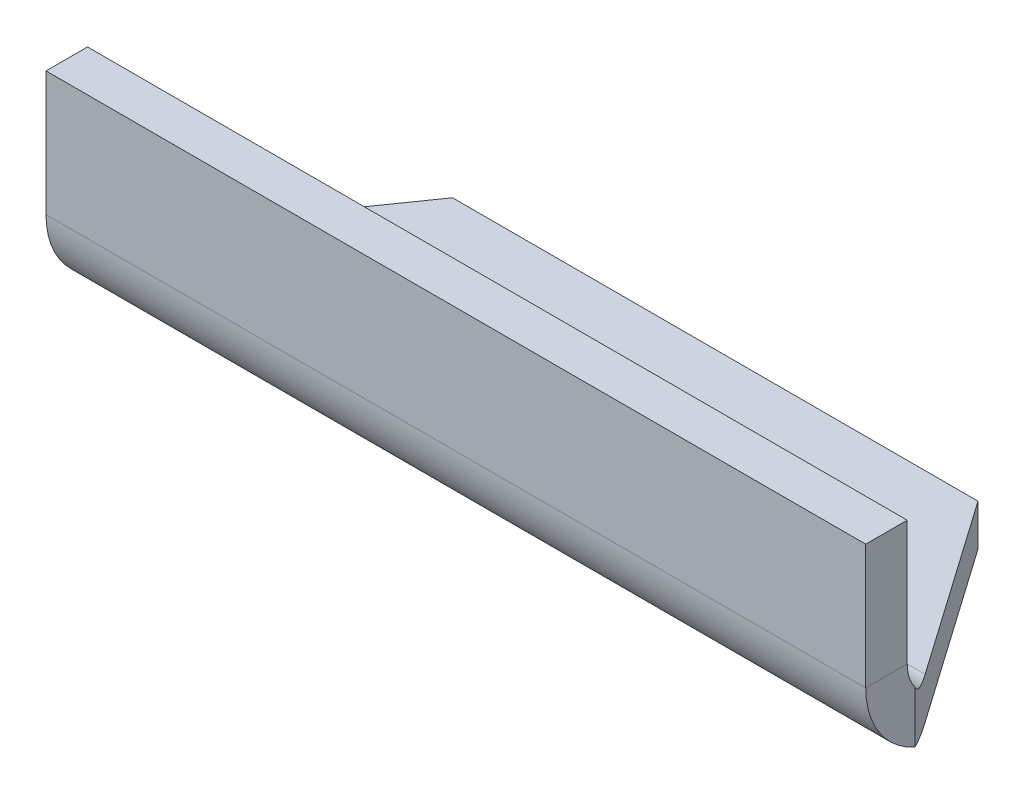
ISO-10303-21;
HEADER;
FILE_DESCRIPTION(('STEP AP214'),'2;1');
FILE_NAME('part.step','',(''),(''),'','','');
FILE_SCHEMA(('AUTOMOTIVE_DESIGN { 1 0 10303 214 1 1 1 1 }'));
ENDSEC;
DATA;
#1=APPLICATION_CONTEXT('core data for automotive mechanical design processes');
#2=APPLICATION_PROTOCOL_DEFINITION('international standard','automotive_design',2000,#1);
#3=PRODUCT_CONTEXT('',#1,'mechanical');
#4=PRODUCT('Part','Part','',(#3));
#5=PRODUCT_RELATED_PRODUCT_CATEGORY('part','',(#4));
#6=PRODUCT_DEFINITION_FORMATION('','',#4);
#7=PRODUCT_DEFINITION_CONTEXT('part definition',#1,'design');
#8=PRODUCT_DEFINITION('design','',#6,#7);
#9=PRODUCT_DEFINITION_SHAPE('','',#8);
#10=(LENGTH_UNIT() NAMED_UNIT(*) SI_UNIT(.MILLI.,.METRE.));
#11=(NAMED_UNIT(*) PLANE_ANGLE_UNIT() SI_UNIT($,.RADIAN.));
#12=(NAMED_UNIT(*) SI_UNIT($,.STERADIAN.) SOLID_ANGLE_UNIT());
#13=UNCERTAINTY_MEASURE_WITH_UNIT(LENGTH_MEASURE(1.E-05),#10,'distance_accuracy_value','');
#14=(GEOMETRIC_REPRESENTATION_CONTEXT(3) GLOBAL_UNCERTAINTY_ASSIGNED_CONTEXT((#13)) GLOBAL_UNIT_ASSIGNED_CONTEXT((#10,
#11,#12)) REPRESENTATION_CONTEXT('',''));
#15=CARTESIAN_POINT('',(0.,0.,0.));
#16=DIRECTION('',(0.,0.,1.));
#17=DIRECTION('',(1.,0.,0.));
#18=AXIS2_PLACEMENT_3D('',#15,#16,#17);
#19=CARTESIAN_POINT('',(0.,-8.,0.));
#20=DIRECTION('',(0.,-1.,0.));
#21=DIRECTION('',(0.,0.,-1.));
#22=AXIS2_PLACEMENT_3D('',#19,#20,#21);
#23=PLANE('',#22);
#24=DIRECTION('',(-1.,0.,0.));
#25=VECTOR('',#24,1.);
#26=CARTESIAN_POINT('',(-79.,-8.,-25.));
#27=LINE('',#26,#25);
#28=CARTESIAN_POINT('',(50.6415947025063,-8.,-25.));
#29=VERTEX_POINT('',#28);
#30=CARTESIAN_POINT('',(-50.6415947025063,-8.,-25.));
#31=VERTEX_POINT('',#30);
#32=EDGE_CURVE('E183',#29,#31,#27,.T.);
#33=ORIENTED_EDGE('',*,*,#32,.F.);
#34=DIRECTION('',(0.573576436351051,0.,0.819152044288988));
#35=VECTOR('',#34,1.);
#36=CARTESIAN_POINT('',(45.7271778502726,-8.,-32.0185146318173));
#37=LINE('',#36,#35);
#38=CARTESIAN_POINT('',(74.4486510016368,-8.00000000000003,9.00000000000003));
#39=VERTEX_POINT('',#38);
#40=EDGE_CURVE('E212',#39,#29,#37,.F.);
#41=ORIENTED_EDGE('',*,*,#40,.F.);
#42=DIRECTION('',(1.,0.,0.));
#43=VECTOR('',#42,1.);
#44=CARTESIAN_POINT('',(79.,-8.00000000000003,9.00000000000003));
#45=LINE('',#44,#43);
#46=CARTESIAN_POINT('',(-74.4486510016368,-8.00000000000003,9.00000000000003));
#47=VERTEX_POINT('',#46);
#48=EDGE_CURVE('E89',#39,#47,#45,.F.);
#49=ORIENTED_EDGE('',*,*,#48,.T.);
#50=DIRECTION('',(-0.573576436351051,0.,0.819152044288988));
#51=VECTOR('',#50,1.);
#52=CARTESIAN_POINT('',(-45.7271778502726,-8.,-32.0185146318173));
#53=LINE('',#52,#51);
#54=EDGE_CURVE('E13',#47,#31,#53,.F.);
#55=ORIENTED_EDGE('',*,*,#54,.T.);
#56=EDGE_LOOP('',(#33,#41,#49,#55));
#57=FACE_BOUND('',#56,.T.);
#58=ADVANCED_FACE('F65',(#57),#23,.T.);
#59=CARTESIAN_POINT('',(0.,0.,0.));
#60=DIRECTION('',(0.,-1.,0.));
#61=DIRECTION('',(0.,0.,-1.));
#62=AXIS2_PLACEMENT_3D('',#59,#60,#61);
#63=PLANE('',#62);
#64=DIRECTION('',(-0.573576436351051,0.,-0.819152044288988));
#65=VECTOR('',#64,1.);
#66=CARTESIAN_POINT('',(50.6415947025063,0.,-25.));
#67=LINE('',#66,#65);
#68=CARTESIAN_POINT('',(50.6415947025063,0.,-25.));
#69=VERTEX_POINT('',#68);
#70=CARTESIAN_POINT('',(74.4486510016367,0.,9.00000000000002));
#71=VERTEX_POINT('',#70);
#72=EDGE_CURVE('E82',#69,#71,#67,.F.);
#73=ORIENTED_EDGE('',*,*,#72,.F.);
#74=DIRECTION('',(-1.,0.,0.));
#75=VECTOR('',#74,1.);
#76=CARTESIAN_POINT('',(-79.,0.,-25.));
#77=LINE('',#76,#75);
#78=CARTESIAN_POINT('',(-50.6415947025063,0.,-25.));
#79=VERTEX_POINT('',#78);
#80=EDGE_CURVE('E187',#69,#79,#77,.T.);
#81=ORIENTED_EDGE('',*,*,#80,.T.);
#82=DIRECTION('',(0.573576436351051,0.,-0.819152044288988));
#83=VECTOR('',#82,1.);
#84=CARTESIAN_POINT('',(-50.6415947025063,0.,-25.));
#85=LINE('',#84,#83);
#86=CARTESIAN_POINT('',(-74.4486510016368,0.,9.00000000000002));
#87=VERTEX_POINT('',#86);
#88=EDGE_CURVE('E193',#79,#87,#85,.F.);
#89=ORIENTED_EDGE('',*,*,#88,.T.);
#90=DIRECTION('',(1.,0.,0.));
#91=VECTOR('',#90,1.);
#92=CARTESIAN_POINT('',(79.,0.,9.00000000000002));
#93=LINE('',#92,#91);
#94=EDGE_CURVE('E173',#71,#87,#93,.F.);
#95=ORIENTED_EDGE('',*,*,#94,.F.);
#96=EDGE_LOOP('',(#73,#81,#89,#95));
#97=FACE_BOUND('',#96,.T.);
#98=ADVANCED_FACE('F301',(#97),#63,.F.);
#99=CARTESIAN_POINT('',(-79.,-8.,-25.));
#100=DIRECTION('',(0.,0.,-1.));
#101=DIRECTION('',(-1.,0.,0.));
#102=AXIS2_PLACEMENT_3D('',#99,#100,#101);
#103=PLANE('',#102);
#104=ORIENTED_EDGE('',*,*,#80,.F.);
#105=DIRECTION('',(0.,1.,0.));
#106=VECTOR('',#105,1.);
#107=CARTESIAN_POINT('',(50.6415947025063,-8.,-25.));
#108=LINE('',#107,#106);
#109=EDGE_CURVE('E217',#29,#69,#108,.T.);
#110=ORIENTED_EDGE('',*,*,#109,.F.);
#111=ORIENTED_EDGE('',*,*,#32,.T.);
#112=DIRECTION('',(0.,1.,0.));
#113=VECTOR('',#112,1.);
#114=CARTESIAN_POINT('',(-50.6415947025063,-8.,-25.));
#115=LINE('',#114,#113);
#116=EDGE_CURVE('E186',#31,#79,#115,.T.);
#117=ORIENTED_EDGE('',*,*,#116,.T.);
#118=EDGE_LOOP('',(#104,#110,#111,#117));
#119=FACE_BOUND('',#118,.T.);
#120=ADVANCED_FACE('F216',(#119),#103,.T.);
#121=CARTESIAN_POINT('',(79.,7.99999999999997,9.00000000000002));
#122=DIRECTION('',(-1.,0.,0.));
#123=DIRECTION('',(0.,0.,1.));
#124=AXIS2_PLACEMENT_3D('',#121,#122,#123);
#125=PLANE('',#124);
#126=CARTESIAN_POINT('',(79.,7.99999999999997,9.00000000000002));
#127=DIRECTION('',(1.,0.,0.));
#128=DIRECTION('',(0.,0.,-1.));
#129=AXIS2_PLACEMENT_3D('',#126,#127,#128);
#130=CIRCLE('',#129,16.);
#131=CARTESIAN_POINT('',(79.,7.99999999999997,25.));
#132=VERTEX_POINT('',#131);
#133=CARTESIAN_POINT('',(79.,-6.62019151721339,15.5000000000002));
#134=VERTEX_POINT('',#133);
#135=EDGE_CURVE('E157',#132,#134,#130,.T.);
#136=ORIENTED_EDGE('',*,*,#135,.T.);
#137=DIRECTION('',(0.,-1.,0.));
#138=VECTOR('',#137,1.);
#139=CARTESIAN_POINT('',(79.,7.99999999999997,15.5000000000002));
#140=LINE('',#139,#138);
#141=CARTESIAN_POINT('',(79.,3.33631047345583,15.5000000000002));
#142=VERTEX_POINT('',#141);
#143=EDGE_CURVE('E143',#142,#134,#140,.T.);
#144=ORIENTED_EDGE('',*,*,#143,.F.);
#145=CARTESIAN_POINT('',(79.,7.99999999999997,9.00000000000002));
#146=DIRECTION('',(1.,0.,0.));
#147=DIRECTION('',(0.,0.,-1.));
#148=AXIS2_PLACEMENT_3D('',#145,#146,#147);
#149=CIRCLE('',#148,8.);
#150=CARTESIAN_POINT('',(79.,7.99999999999997,17.));
#151=VERTEX_POINT('',#150);
#152=EDGE_CURVE('E179',#151,#142,#149,.T.);
#153=ORIENTED_EDGE('',*,*,#152,.F.);
#154=DIRECTION('',(0.,0.,-1.));
#155=VECTOR('',#154,1.);
#156=CARTESIAN_POINT('',(79.,7.99999999999997,17.));
#157=LINE('',#156,#155);
#158=EDGE_CURVE('E163',#151,#132,#157,.F.);
#159=ORIENTED_EDGE('',*,*,#158,.T.);
#160=EDGE_LOOP('',(#136,#144,#153,#159));
#161=FACE_BOUND('',#160,.T.);
#162=ADVANCED_FACE('F161',(#161),#125,.F.);
#163=CARTESIAN_POINT('',(79.,7.99999999999997,9.00000000000002));
#164=DIRECTION('',(1.,0.,0.));
#165=DIRECTION('',(0.,0.,1.));
#166=AXIS2_PLACEMENT_3D('',#163,#164,#165);
#167=CYLINDRICAL_SURFACE('',#166,16.);
#168=ORIENTED_EDGE('',*,*,#48,.F.);
#169=CARTESIAN_POINT('',(74.4486510016368,7.99999999999997,9.00000000000002));
#170=DIRECTION('',(0.819152044288988,0.,-0.573576436351051));
#171=DIRECTION('',(-0.573576436351051,0.,-0.819152044288988));
#172=AXIS2_PLACEMENT_3D('',#169,#170,#171);
#173=ELLIPSE('',#172,19.5323934201834,16.);
#174=EDGE_CURVE('E146',#134,#39,#173,.T.);
#175=ORIENTED_EDGE('',*,*,#174,.F.);
#176=ORIENTED_EDGE('',*,*,#135,.F.);
#177=DIRECTION('',(1.,0.,0.));
#178=VECTOR('',#177,1.);
#179=CARTESIAN_POINT('',(-79.,7.99999999999997,25.));
#180=LINE('',#179,#178);
#181=CARTESIAN_POINT('',(-79.,7.99999999999997,25.));
#182=VERTEX_POINT('',#181);
#183=EDGE_CURVE('E255',#132,#182,#180,.F.);
#184=ORIENTED_EDGE('',*,*,#183,.T.);
#185=CARTESIAN_POINT('',(-79.,7.99999999999997,9.00000000000002));
#186=DIRECTION('',(1.,0.,0.));
#187=DIRECTION('',(0.,0.,-1.));
#188=AXIS2_PLACEMENT_3D('',#185,#186,#187);
#189=CIRCLE('',#188,16.);
#190=CARTESIAN_POINT('',(-79.,-6.62019151721339,15.5000000000002));
#191=VERTEX_POINT('',#190);
#192=EDGE_CURVE('E171',#191,#182,#189,.F.);
#193=ORIENTED_EDGE('',*,*,#192,.F.);
#194=CARTESIAN_POINT('',(-74.4486510016368,7.99999999999997,9.00000000000002));
#195=DIRECTION('',(0.819152044288988,0.,0.573576436351051));
#196=DIRECTION('',(0.573576436351051,0.,-0.819152044288988));
#197=AXIS2_PLACEMENT_3D('',#194,#195,#196);
#198=ELLIPSE('',#197,19.5323934201834,16.);
#199=EDGE_CURVE('E75',#191,#47,#198,.T.);
#200=ORIENTED_EDGE('',*,*,#199,.T.);
#201=EDGE_LOOP('',(#168,#175,#176,#184,#193,#200));
#202=FACE_BOUND('',#201,.T.);
#203=ADVANCED_FACE('F155',(#202),#167,.T.);
#204=CARTESIAN_POINT('',(79.,7.99999999999997,9.00000000000002));
#205=DIRECTION('',(1.,0.,0.));
#206=DIRECTION('',(0.,0.,1.));
#207=AXIS2_PLACEMENT_3D('',#204,#205,#206);
#208=CYLINDRICAL_SURFACE('',#207,8.);
#209=CARTESIAN_POINT('',(74.4486510016368,7.99999999999997,9.00000000000002));
#210=DIRECTION('',(0.819152044288988,0.,-0.573576436351051));
#211=DIRECTION('',(-0.573576436351051,0.,-0.819152044288988));
#212=AXIS2_PLACEMENT_3D('',#209,#210,#211);
#213=ELLIPSE('',#212,9.76619671009169,8.);
#214=EDGE_CURVE('E147',#71,#142,#213,.F.);
#215=ORIENTED_EDGE('',*,*,#214,.F.);
#216=ORIENTED_EDGE('',*,*,#94,.T.);
#217=CARTESIAN_POINT('',(-74.4486510016368,7.99999999999997,9.00000000000002));
#218=DIRECTION('',(0.819152044288988,0.,0.573576436351051));
#219=DIRECTION('',(0.573576436351051,0.,-0.819152044288988));
#220=AXIS2_PLACEMENT_3D('',#217,#218,#219);
#221=ELLIPSE('',#220,9.76619671009169,8.);
#222=CARTESIAN_POINT('',(-79.,3.33631047345583,15.5000000000002));
#223=VERTEX_POINT('',#222);
#224=EDGE_CURVE('E197',#87,#223,#221,.F.);
#225=ORIENTED_EDGE('',*,*,#224,.T.);
#226=CARTESIAN_POINT('',(-79.,7.99999999999997,9.00000000000002));
#227=DIRECTION('',(1.,0.,0.));
#228=DIRECTION('',(0.,0.,-1.));
#229=AXIS2_PLACEMENT_3D('',#226,#227,#228);
#230=CIRCLE('',#229,8.);
#231=CARTESIAN_POINT('',(-79.,7.99999999999997,17.));
#232=VERTEX_POINT('',#231);
#233=EDGE_CURVE('E166',#223,#232,#230,.F.);
#234=ORIENTED_EDGE('',*,*,#233,.T.);
#235=DIRECTION('',(1.,0.,0.));
#236=VECTOR('',#235,1.);
#237=CARTESIAN_POINT('',(-79.,7.99999999999997,17.));
#238=LINE('',#237,#236);
#239=EDGE_CURVE('E260',#232,#151,#238,.T.);
#240=ORIENTED_EDGE('',*,*,#239,.T.);
#241=ORIENTED_EDGE('',*,*,#152,.T.);
#242=EDGE_LOOP('',(#215,#216,#225,#234,#240,#241));
#243=FACE_BOUND('',#242,.T.);
#244=ADVANCED_FACE('F287',(#243),#208,.F.);
#245=CARTESIAN_POINT('',(-79.,7.99999999999997,9.00000000000002));
#246=DIRECTION('',(-1.,0.,0.));
#247=DIRECTION('',(0.,0.,1.));
#248=AXIS2_PLACEMENT_3D('',#245,#246,#247);
#249=PLANE('',#248);
#250=ORIENTED_EDGE('',*,*,#233,.F.);
#251=DIRECTION('',(0.,-1.,0.));
#252=VECTOR('',#251,1.);
#253=CARTESIAN_POINT('',(-79.,7.99999999999997,15.5000000000002));
#254=LINE('',#253,#252);
#255=EDGE_CURVE('E200',#223,#191,#254,.T.);
#256=ORIENTED_EDGE('',*,*,#255,.T.);
#257=ORIENTED_EDGE('',*,*,#192,.T.);
#258=DIRECTION('',(0.,0.,-1.));
#259=VECTOR('',#258,1.);
#260=CARTESIAN_POINT('',(-79.,7.99999999999997,25.));
#261=LINE('',#260,#259);
#262=EDGE_CURVE('E223',#232,#182,#261,.F.);
#263=ORIENTED_EDGE('',*,*,#262,.F.);
#264=EDGE_LOOP('',(#250,#256,#257,#263));
#265=FACE_BOUND('',#264,.T.);
#266=ADVANCED_FACE('F297',(#265),#249,.T.);
#267=CARTESIAN_POINT('',(-79.,0.,25.));
#268=DIRECTION('',(1.,0.,0.));
#269=DIRECTION('',(0.,1.,0.));
#270=AXIS2_PLACEMENT_3D('',#267,#268,#269);
#271=PLANE('',#270);
#272=ORIENTED_EDGE('',*,*,#262,.T.);
#273=DIRECTION('',(0.,-1.,0.));
#274=VECTOR('',#273,1.);
#275=CARTESIAN_POINT('',(-79.,1.02782365951626E-13,25.));
#276=LINE('',#275,#274);
#277=CARTESIAN_POINT('',(-79.,32.,25.));
#278=VERTEX_POINT('',#277);
#279=EDGE_CURVE('E241',#278,#182,#276,.T.);
#280=ORIENTED_EDGE('',*,*,#279,.F.);
#281=DIRECTION('',(0.,0.,-1.));
#282=VECTOR('',#281,1.);
#283=CARTESIAN_POINT('',(-79.,32.,25.));
#284=LINE('',#283,#282);
#285=CARTESIAN_POINT('',(-79.,32.,17.));
#286=VERTEX_POINT('',#285);
#287=EDGE_CURVE('E231',#278,#286,#284,.T.);
#288=ORIENTED_EDGE('',*,*,#287,.T.);
#289=DIRECTION('',(0.,1.,0.));
#290=VECTOR('',#289,1.);
#291=CARTESIAN_POINT('',(-79.,0.,17.));
#292=LINE('',#291,#290);
#293=EDGE_CURVE('E251',#286,#232,#292,.F.);
#294=ORIENTED_EDGE('',*,*,#293,.T.);
#295=EDGE_LOOP('',(#272,#280,#288,#294));
#296=FACE_BOUND('',#295,.T.);
#297=ADVANCED_FACE('F269',(#296),#271,.F.);
#298=CARTESIAN_POINT('',(79.,32.,25.));
#299=DIRECTION('',(-1.,0.,0.));
#300=DIRECTION('',(0.,-1.,0.));
#301=AXIS2_PLACEMENT_3D('',#298,#299,#300);
#302=PLANE('',#301);
#303=ORIENTED_EDGE('',*,*,#158,.F.);
#304=DIRECTION('',(0.,-1.,0.));
#305=VECTOR('',#304,1.);
#306=CARTESIAN_POINT('',(79.,32.,17.));
#307=LINE('',#306,#305);
#308=CARTESIAN_POINT('',(79.,32.,17.));
#309=VERTEX_POINT('',#308);
#310=EDGE_CURVE('E248',#151,#309,#307,.F.);
#311=ORIENTED_EDGE('',*,*,#310,.T.);
#312=DIRECTION('',(0.,0.,-1.));
#313=VECTOR('',#312,1.);
#314=CARTESIAN_POINT('',(79.,32.,25.));
#315=LINE('',#314,#313);
#316=CARTESIAN_POINT('',(79.,32.,25.));
#317=VERTEX_POINT('',#316);
#318=EDGE_CURVE('E182',#317,#309,#315,.T.);
#319=ORIENTED_EDGE('',*,*,#318,.F.);
#320=DIRECTION('',(0.,1.,0.));
#321=VECTOR('',#320,1.);
#322=CARTESIAN_POINT('',(79.,-1.37043154602168E-13,25.));
#323=LINE('',#322,#321);
#324=EDGE_CURVE('E238',#132,#317,#323,.T.);
#325=ORIENTED_EDGE('',*,*,#324,.F.);
#326=EDGE_LOOP('',(#303,#311,#319,#325));
#327=FACE_BOUND('',#326,.T.);
#328=ADVANCED_FACE('F289',(#327),#302,.F.);
#329=CARTESIAN_POINT('',(0.,0.,25.));
#330=DIRECTION('',(0.,0.,-1.));
#331=DIRECTION('',(-1.,0.,0.));
#332=AXIS2_PLACEMENT_3D('',#329,#330,#331);
#333=PLANE('',#332);
#334=ORIENTED_EDGE('',*,*,#183,.F.);
#335=ORIENTED_EDGE('',*,*,#324,.T.);
#336=DIRECTION('',(-1.,0.,0.));
#337=VECTOR('',#336,1.);
#338=CARTESIAN_POINT('',(0.,32.,25.));
#339=LINE('',#338,#337);
#340=EDGE_CURVE('E235',#317,#278,#339,.T.);
#341=ORIENTED_EDGE('',*,*,#340,.T.);
#342=ORIENTED_EDGE('',*,*,#279,.T.);
#343=EDGE_LOOP('',(#334,#335,#341,#342));
#344=FACE_BOUND('',#343,.T.);
#345=ADVANCED_FACE('F275',(#344),#333,.F.);
#346=CARTESIAN_POINT('',(0.,0.,17.));
#347=DIRECTION('',(0.,0.,-1.));
#348=DIRECTION('',(-1.,0.,0.));
#349=AXIS2_PLACEMENT_3D('',#346,#347,#348);
#350=PLANE('',#349);
#351=ORIENTED_EDGE('',*,*,#310,.F.);
#352=ORIENTED_EDGE('',*,*,#239,.F.);
#353=ORIENTED_EDGE('',*,*,#293,.F.);
#354=DIRECTION('',(1.,0.,0.));
#355=VECTOR('',#354,1.);
#356=CARTESIAN_POINT('',(-79.,32.,17.));
#357=LINE('',#356,#355);
#358=EDGE_CURVE('E245',#309,#286,#357,.F.);
#359=ORIENTED_EDGE('',*,*,#358,.F.);
#360=EDGE_LOOP('',(#351,#352,#353,#359));
#361=FACE_BOUND('',#360,.T.);
#362=ADVANCED_FACE('F285',(#361),#350,.T.);
#363=CARTESIAN_POINT('',(-79.,32.,25.));
#364=DIRECTION('',(0.,-1.,0.));
#365=DIRECTION('',(0.,0.,-1.));
#366=AXIS2_PLACEMENT_3D('',#363,#364,#365);
#367=PLANE('',#366);
#368=ORIENTED_EDGE('',*,*,#358,.T.);
#369=ORIENTED_EDGE('',*,*,#287,.F.);
#370=ORIENTED_EDGE('',*,*,#340,.F.);
#371=ORIENTED_EDGE('',*,*,#318,.T.);
#372=EDGE_LOOP('',(#368,#369,#370,#371));
#373=FACE_BOUND('',#372,.T.);
#374=ADVANCED_FACE('F281',(#373),#367,.F.);
#375=CARTESIAN_POINT('',(-50.6415947025063,-8.,-25.));
#376=DIRECTION('',(0.819152044288988,0.,0.573576436351051));
#377=DIRECTION('',(0.,1.,0.));
#378=AXIS2_PLACEMENT_3D('',#375,#376,#377);
#379=PLANE('',#378);
#380=ORIENTED_EDGE('',*,*,#199,.F.);
#381=ORIENTED_EDGE('',*,*,#255,.F.);
#382=ORIENTED_EDGE('',*,*,#224,.F.);
#383=ORIENTED_EDGE('',*,*,#88,.F.);
#384=ORIENTED_EDGE('',*,*,#116,.F.);
#385=ORIENTED_EDGE('',*,*,#54,.F.);
#386=EDGE_LOOP('',(#380,#381,#382,#383,#384,#385));
#387=FACE_BOUND('',#386,.T.);
#388=ADVANCED_FACE('F68',(#387),#379,.F.);
#389=CARTESIAN_POINT('',(50.6415947025063,-8.,-25.));
#390=DIRECTION('',(-0.819152044288988,0.,0.573576436351051));
#391=DIRECTION('',(0.,1.,0.));
#392=AXIS2_PLACEMENT_3D('',#389,#390,#391);
#393=PLANE('',#392);
#394=ORIENTED_EDGE('',*,*,#174,.T.);
#395=ORIENTED_EDGE('',*,*,#40,.T.);
#396=ORIENTED_EDGE('',*,*,#109,.T.);
#397=ORIENTED_EDGE('',*,*,#72,.T.);
#398=ORIENTED_EDGE('',*,*,#214,.T.);
#399=ORIENTED_EDGE('',*,*,#143,.T.);
#400=EDGE_LOOP('',(#394,#395,#396,#397,#398,#399));
#401=FACE_BOUND('',#400,.T.);
#402=ADVANCED_FACE('F145',(#401),#393,.F.);
#403=CLOSED_SHELL('',(#58,#98,#120,#162,#203,#244,#266,#297,#328,#345,#362,#374,#388,#402));
#404=MANIFOLD_SOLID_BREP('B2',#403);
#405=ADVANCED_BREP_SHAPE_REPRESENTATION('',(#18,#404),#14);
#406=SHAPE_DEFINITION_REPRESENTATION(#9,#405);
ENDSEC;
END-ISO-10303-21;
